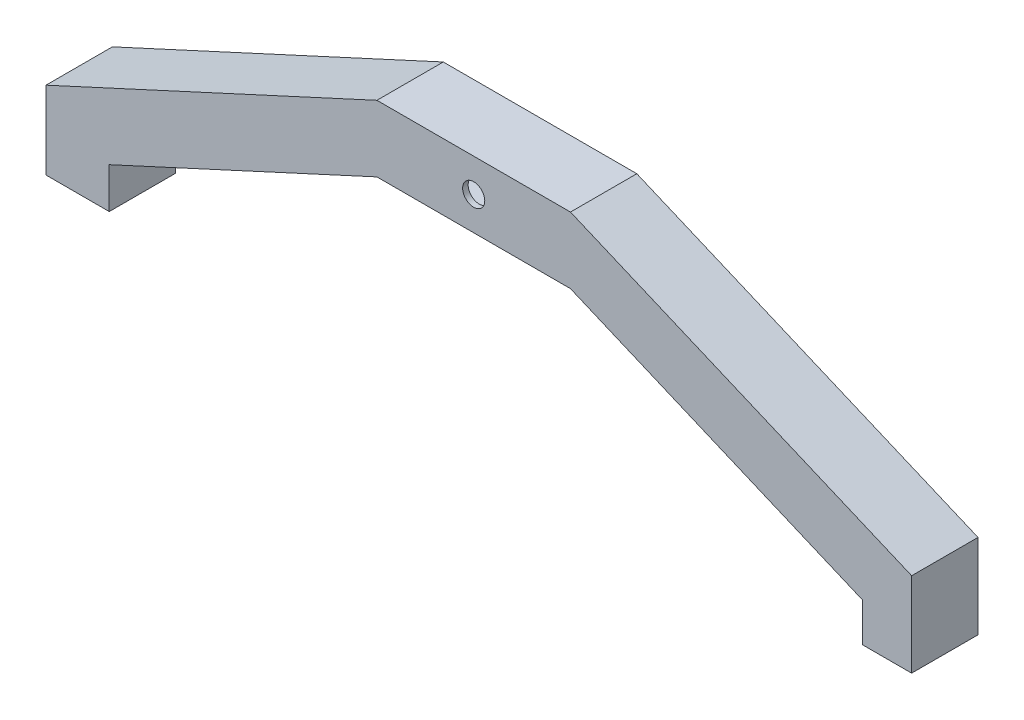
ISO-10303-21;
HEADER;
FILE_DESCRIPTION(('STEP AP214'),'2;1');
FILE_NAME('part.step','',(''),(''),'','','');
FILE_SCHEMA(('AUTOMOTIVE_DESIGN { 1 0 10303 214 1 1 1 1 }'));
ENDSEC;
DATA;
#1=APPLICATION_CONTEXT('core data for automotive mechanical design processes');
#2=APPLICATION_PROTOCOL_DEFINITION('international standard','automotive_design',2000,#1);
#3=PRODUCT_CONTEXT('',#1,'mechanical');
#4=PRODUCT('Part','Part','',(#3));
#5=PRODUCT_RELATED_PRODUCT_CATEGORY('part','',(#4));
#6=PRODUCT_DEFINITION_FORMATION('','',#4);
#7=PRODUCT_DEFINITION_CONTEXT('part definition',#1,'design');
#8=PRODUCT_DEFINITION('design','',#6,#7);
#9=PRODUCT_DEFINITION_SHAPE('','',#8);
#10=(LENGTH_UNIT() NAMED_UNIT(*) SI_UNIT(.MILLI.,.METRE.));
#11=(NAMED_UNIT(*) PLANE_ANGLE_UNIT() SI_UNIT($,.RADIAN.));
#12=(NAMED_UNIT(*) SI_UNIT($,.STERADIAN.) SOLID_ANGLE_UNIT());
#13=UNCERTAINTY_MEASURE_WITH_UNIT(LENGTH_MEASURE(1.E-05),#10,'distance_accuracy_value','');
#14=(GEOMETRIC_REPRESENTATION_CONTEXT(3) GLOBAL_UNCERTAINTY_ASSIGNED_CONTEXT((#13)) GLOBAL_UNIT_ASSIGNED_CONTEXT((#10,
#11,#12)) REPRESENTATION_CONTEXT('',''));
#15=CARTESIAN_POINT('',(0.,0.,0.));
#16=DIRECTION('',(0.,0.,1.));
#17=DIRECTION('',(1.,0.,0.));
#18=AXIS2_PLACEMENT_3D('',#15,#16,#17);
#19=CARTESIAN_POINT('',(0.,-35.6300000000504,12.));
#20=DIRECTION('',(0.,1.,0.));
#21=DIRECTION('',(0.,0.,1.));
#22=AXIS2_PLACEMENT_3D('',#19,#20,#21);
#23=PLANE('',#22);
#24=DIRECTION('',(1.,0.,0.));
#25=VECTOR('',#24,1.);
#26=CARTESIAN_POINT('',(0.,-35.6300000000504,0.));
#27=LINE('',#26,#25);
#28=CARTESIAN_POINT('',(-77.342905626536,-35.6300000000504,0.));
#29=VERTEX_POINT('',#28);
#30=CARTESIAN_POINT('',(-65.9062886066089,-35.6300000000504,0.));
#31=VERTEX_POINT('',#30);
#32=EDGE_CURVE('E191',#29,#31,#27,.T.);
#33=ORIENTED_EDGE('',*,*,#32,.T.);
#34=DIRECTION('',(0.,0.,-1.));
#35=VECTOR('',#34,1.);
#36=CARTESIAN_POINT('',(-65.9062886066089,-35.6300000000504,12.));
#37=LINE('',#36,#35);
#38=CARTESIAN_POINT('',(-65.9062886066089,-35.6300000000504,12.));
#39=VERTEX_POINT('',#38);
#40=EDGE_CURVE('E209',#39,#31,#37,.T.);
#41=ORIENTED_EDGE('',*,*,#40,.F.);
#42=DIRECTION('',(1.,0.,0.));
#43=VECTOR('',#42,1.);
#44=CARTESIAN_POINT('',(0.,-35.6300000000504,12.));
#45=LINE('',#44,#43);
#46=CARTESIAN_POINT('',(-77.342905626536,-35.6300000000504,12.));
#47=VERTEX_POINT('',#46);
#48=EDGE_CURVE('E250',#47,#39,#45,.T.);
#49=ORIENTED_EDGE('',*,*,#48,.F.);
#50=DIRECTION('',(0.,0.,-1.));
#51=VECTOR('',#50,1.);
#52=CARTESIAN_POINT('',(-77.342905626536,-35.6300000000504,12.));
#53=LINE('',#52,#51);
#54=EDGE_CURVE('E211',#47,#29,#53,.T.);
#55=ORIENTED_EDGE('',*,*,#54,.T.);
#56=EDGE_LOOP('',(#33,#41,#49,#55));
#57=FACE_BOUND('',#56,.T.);
#58=DIRECTION('',(1.,0.,0.));
#59=VECTOR('',#58,1.);
#60=CARTESIAN_POINT('',(0.,-35.6300000000504,1.));
#61=LINE('',#60,#59);
#62=CARTESIAN_POINT('',(-76.342905626536,-35.6300000000504,1.));
#63=VERTEX_POINT('',#62);
#64=CARTESIAN_POINT('',(-66.9062886066089,-35.6300000000504,1.));
#65=VERTEX_POINT('',#64);
#66=EDGE_CURVE('E626',#63,#65,#61,.T.);
#67=ORIENTED_EDGE('',*,*,#66,.F.);
#68=DIRECTION('',(0.,0.,-1.));
#69=VECTOR('',#68,1.);
#70=CARTESIAN_POINT('',(-76.342905626536,-35.6300000000504,12.));
#71=LINE('',#70,#69);
#72=CARTESIAN_POINT('',(-76.342905626536,-35.6300000000504,11.));
#73=VERTEX_POINT('',#72);
#74=EDGE_CURVE('E620',#73,#63,#71,.T.);
#75=ORIENTED_EDGE('',*,*,#74,.F.);
#76=DIRECTION('',(1.,0.,0.));
#77=VECTOR('',#76,1.);
#78=CARTESIAN_POINT('',(0.,-35.6300000000504,11.));
#79=LINE('',#78,#77);
#80=CARTESIAN_POINT('',(-66.9062886066089,-35.6300000000504,11.));
#81=VERTEX_POINT('',#80);
#82=EDGE_CURVE('E55',#73,#81,#79,.T.);
#83=ORIENTED_EDGE('',*,*,#82,.T.);
#84=DIRECTION('',(0.,0.,-1.));
#85=VECTOR('',#84,1.);
#86=CARTESIAN_POINT('',(-66.9062886066089,-35.6300000000504,12.));
#87=LINE('',#86,#85);
#88=EDGE_CURVE('E648',#81,#65,#87,.T.);
#89=ORIENTED_EDGE('',*,*,#88,.T.);
#90=EDGE_LOOP('',(#67,#75,#83,#89));
#91=FACE_BOUND('',#90,.T.);
#92=ADVANCED_FACE('F39',(#57,#91),#23,.F.);
#93=CARTESIAN_POINT('',(0.,-35.3685376037723,12.));
#94=DIRECTION('',(0.,1.,0.));
#95=DIRECTION('',(0.,0.,1.));
#96=AXIS2_PLACEMENT_3D('',#93,#94,#95);
#97=PLANE('',#96);
#98=DIRECTION('',(1.,0.,0.));
#99=VECTOR('',#98,1.);
#100=CARTESIAN_POINT('',(0.,-35.3685376037723,0.));
#101=LINE('',#100,#99);
#102=CARTESIAN_POINT('',(70.2639033973968,-35.3685376037723,0.));
#103=VERTEX_POINT('',#102);
#104=CARTESIAN_POINT('',(79.1949734298234,-35.3685376037723,0.));
#105=VERTEX_POINT('',#104);
#106=EDGE_CURVE('E174',#103,#105,#101,.T.);
#107=ORIENTED_EDGE('',*,*,#106,.T.);
#108=DIRECTION('',(0.,0.,-1.));
#109=VECTOR('',#108,1.);
#110=CARTESIAN_POINT('',(79.1949734298234,-35.3685376037723,12.));
#111=LINE('',#110,#109);
#112=CARTESIAN_POINT('',(79.1949734298234,-35.3685376037723,12.));
#113=VERTEX_POINT('',#112);
#114=EDGE_CURVE('E11',#113,#105,#111,.T.);
#115=ORIENTED_EDGE('',*,*,#114,.F.);
#116=DIRECTION('',(1.,0.,0.));
#117=VECTOR('',#116,1.);
#118=CARTESIAN_POINT('',(0.,-35.3685376037723,12.));
#119=LINE('',#118,#117);
#120=CARTESIAN_POINT('',(70.2639033973968,-35.3685376037723,12.));
#121=VERTEX_POINT('',#120);
#122=EDGE_CURVE('E203',#121,#113,#119,.T.);
#123=ORIENTED_EDGE('',*,*,#122,.F.);
#124=DIRECTION('',(0.,0.,-1.));
#125=VECTOR('',#124,1.);
#126=CARTESIAN_POINT('',(70.2639033973968,-35.3685376037723,12.));
#127=LINE('',#126,#125);
#128=EDGE_CURVE('E170',#121,#103,#127,.T.);
#129=ORIENTED_EDGE('',*,*,#128,.T.);
#130=EDGE_LOOP('',(#107,#115,#123,#129));
#131=FACE_BOUND('',#130,.T.);
#132=ADVANCED_FACE('F41',(#131),#97,.F.);
#133=CARTESIAN_POINT('',(79.1949734298234,0.,12.));
#134=DIRECTION('',(-1.,0.,0.));
#135=DIRECTION('',(0.,0.,1.));
#136=AXIS2_PLACEMENT_3D('',#133,#134,#135);
#137=PLANE('',#136);
#138=DIRECTION('',(0.,1.,0.));
#139=VECTOR('',#138,1.);
#140=CARTESIAN_POINT('',(79.1949734298234,0.,0.));
#141=LINE('',#140,#139);
#142=CARTESIAN_POINT('',(79.1949734298234,-20.1080830229284,0.));
#143=VERTEX_POINT('',#142);
#144=EDGE_CURVE('E177',#105,#143,#141,.T.);
#145=ORIENTED_EDGE('',*,*,#144,.T.);
#146=DIRECTION('',(0.,0.,-1.));
#147=VECTOR('',#146,1.);
#148=CARTESIAN_POINT('',(79.1949734298234,-20.1080830229284,12.));
#149=LINE('',#148,#147);
#150=CARTESIAN_POINT('',(79.1949734298234,-20.1080830229284,12.));
#151=VERTEX_POINT('',#150);
#152=EDGE_CURVE('E48',#151,#143,#149,.T.);
#153=ORIENTED_EDGE('',*,*,#152,.F.);
#154=DIRECTION('',(0.,1.,0.));
#155=VECTOR('',#154,1.);
#156=CARTESIAN_POINT('',(79.1949734298234,0.,12.));
#157=LINE('',#156,#155);
#158=EDGE_CURVE('E117',#113,#151,#157,.T.);
#159=ORIENTED_EDGE('',*,*,#158,.F.);
#160=ORIENTED_EDGE('',*,*,#114,.T.);
#161=EDGE_LOOP('',(#145,#153,#159,#160));
#162=FACE_BOUND('',#161,.T.);
#163=ADVANCED_FACE('F227',(#162),#137,.F.);
#164=CARTESIAN_POINT('',(4.81137648257786,11.3695725570298,12.));
#165=DIRECTION('',(0.389720557312309,0.920933161097038,0.));
#166=DIRECTION('',(-0.920933161097038,0.389720557312309,0.));
#167=AXIS2_PLACEMENT_3D('',#164,#165,#166);
#168=PLANE('',#167);
#169=DIRECTION('',(0.920933161097038,-0.389720557312309,0.));
#170=VECTOR('',#169,1.);
#171=CARTESIAN_POINT('',(4.81137648257786,11.3695725570298,0.));
#172=LINE('',#171,#170);
#173=CARTESIAN_POINT('',(17.4999999999895,5.99999999994959,0.));
#174=VERTEX_POINT('',#173);
#175=EDGE_CURVE('E181',#174,#143,#172,.T.);
#176=ORIENTED_EDGE('',*,*,#175,.F.);
#177=DIRECTION('',(0.,0.,-1.));
#178=VECTOR('',#177,1.);
#179=CARTESIAN_POINT('',(17.4999999999895,5.99999999994959,12.));
#180=LINE('',#179,#178);
#181=CARTESIAN_POINT('',(17.4999999999895,5.99999999994959,12.));
#182=VERTEX_POINT('',#181);
#183=EDGE_CURVE('E219',#182,#174,#180,.T.);
#184=ORIENTED_EDGE('',*,*,#183,.F.);
#185=DIRECTION('',(0.920933161097038,-0.389720557312309,0.));
#186=VECTOR('',#185,1.);
#187=CARTESIAN_POINT('',(4.81137648257786,11.3695725570298,12.));
#188=LINE('',#187,#186);
#189=EDGE_CURVE('E226',#182,#151,#188,.T.);
#190=ORIENTED_EDGE('',*,*,#189,.T.);
#191=ORIENTED_EDGE('',*,*,#152,.T.);
#192=EDGE_LOOP('',(#176,#184,#190,#191));
#193=FACE_BOUND('',#192,.T.);
#194=ADVANCED_FACE('F224',(#193),#168,.T.);
#195=CARTESIAN_POINT('',(0.,5.99999999994959,12.));
#196=DIRECTION('',(0.,1.,0.));
#197=DIRECTION('',(0.,0.,1.));
#198=AXIS2_PLACEMENT_3D('',#195,#196,#197);
#199=PLANE('',#198);
#200=DIRECTION('',(1.,0.,0.));
#201=VECTOR('',#200,1.);
#202=CARTESIAN_POINT('',(0.,5.99999999994959,0.));
#203=LINE('',#202,#201);
#204=CARTESIAN_POINT('',(-17.5000000000105,5.9999999999496,0.));
#205=VERTEX_POINT('',#204);
#206=EDGE_CURVE('E184',#205,#174,#203,.T.);
#207=ORIENTED_EDGE('',*,*,#206,.F.);
#208=DIRECTION('',(0.,0.,-1.));
#209=VECTOR('',#208,1.);
#210=CARTESIAN_POINT('',(-17.5000000000105,5.9999999999496,12.));
#211=LINE('',#210,#209);
#212=CARTESIAN_POINT('',(-17.5000000000105,5.9999999999496,12.));
#213=VERTEX_POINT('',#212);
#214=EDGE_CURVE('E217',#213,#205,#211,.T.);
#215=ORIENTED_EDGE('',*,*,#214,.F.);
#216=DIRECTION('',(1.,0.,0.));
#217=VECTOR('',#216,1.);
#218=CARTESIAN_POINT('',(0.,5.99999999994959,12.));
#219=LINE('',#218,#217);
#220=EDGE_CURVE('E240',#213,#182,#219,.T.);
#221=ORIENTED_EDGE('',*,*,#220,.T.);
#222=ORIENTED_EDGE('',*,*,#183,.T.);
#223=EDGE_LOOP('',(#207,#215,#221,#222));
#224=FACE_BOUND('',#223,.T.);
#225=ADVANCED_FACE('F236',(#224),#199,.T.);
#226=CARTESIAN_POINT('',(-5.33954145580796,11.5983296353314,12.));
#227=DIRECTION('',(0.418184177516307,-0.908362259054728,0.));
#228=DIRECTION('',(0.908362259054729,0.418184177516307,0.));
#229=AXIS2_PLACEMENT_3D('',#226,#227,#228);
#230=PLANE('',#229);
#231=DIRECTION('',(-0.908362259054729,-0.418184177516307,0.));
#232=VECTOR('',#231,1.);
#233=CARTESIAN_POINT('',(-5.33954145580796,11.5983296353314,0.));
#234=LINE('',#233,#232);
#235=CARTESIAN_POINT('',(-77.342905626536,-21.5499736148247,0.));
#236=VERTEX_POINT('',#235);
#237=EDGE_CURVE('E187',#205,#236,#234,.T.);
#238=ORIENTED_EDGE('',*,*,#237,.T.);
#239=DIRECTION('',(0.,0.,-1.));
#240=VECTOR('',#239,1.);
#241=CARTESIAN_POINT('',(-77.342905626536,-21.5499736148247,12.));
#242=LINE('',#241,#240);
#243=CARTESIAN_POINT('',(-77.342905626536,-21.5499736148247,12.));
#244=VERTEX_POINT('',#243);
#245=EDGE_CURVE('E214',#244,#236,#242,.T.);
#246=ORIENTED_EDGE('',*,*,#245,.F.);
#247=DIRECTION('',(-0.908362259054729,-0.418184177516307,0.));
#248=VECTOR('',#247,1.);
#249=CARTESIAN_POINT('',(-5.33954145580796,11.5983296353314,12.));
#250=LINE('',#249,#248);
#251=EDGE_CURVE('E242',#213,#244,#250,.T.);
#252=ORIENTED_EDGE('',*,*,#251,.F.);
#253=ORIENTED_EDGE('',*,*,#214,.T.);
#254=EDGE_LOOP('',(#238,#246,#252,#253));
#255=FACE_BOUND('',#254,.T.);
#256=ADVANCED_FACE('F285',(#255),#230,.F.);
#257=CARTESIAN_POINT('',(-77.342905626536,0.,12.));
#258=DIRECTION('',(1.,0.,0.));
#259=DIRECTION('',(0.,0.,-1.));
#260=AXIS2_PLACEMENT_3D('',#257,#258,#259);
#261=PLANE('',#260);
#262=DIRECTION('',(0.,-1.,0.));
#263=VECTOR('',#262,1.);
#264=CARTESIAN_POINT('',(-77.342905626536,0.,0.));
#265=LINE('',#264,#263);
#266=EDGE_CURVE('E189',#236,#29,#265,.T.);
#267=ORIENTED_EDGE('',*,*,#266,.T.);
#268=ORIENTED_EDGE('',*,*,#54,.F.);
#269=DIRECTION('',(0.,-1.,0.));
#270=VECTOR('',#269,1.);
#271=CARTESIAN_POINT('',(-77.342905626536,0.,12.));
#272=LINE('',#271,#270);
#273=EDGE_CURVE('E248',#244,#47,#272,.T.);
#274=ORIENTED_EDGE('',*,*,#273,.F.);
#275=ORIENTED_EDGE('',*,*,#245,.T.);
#276=EDGE_LOOP('',(#267,#268,#274,#275));
#277=FACE_BOUND('',#276,.T.);
#278=ADVANCED_FACE('F274',(#277),#261,.F.);
#279=CARTESIAN_POINT('',(-65.9062886066089,0.,12.));
#280=DIRECTION('',(1.,0.,0.));
#281=DIRECTION('',(0.,0.,-1.));
#282=AXIS2_PLACEMENT_3D('',#279,#280,#281);
#283=PLANE('',#282);
#284=DIRECTION('',(0.,-1.,0.));
#285=VECTOR('',#284,1.);
#286=CARTESIAN_POINT('',(-65.9062886066089,0.,0.));
#287=LINE('',#286,#285);
#288=CARTESIAN_POINT('',(-65.9062886066089,-28.284880052897,0.));
#289=VERTEX_POINT('',#288);
#290=EDGE_CURVE('E194',#289,#31,#287,.T.);
#291=ORIENTED_EDGE('',*,*,#290,.F.);
#292=DIRECTION('',(0.,0.,-1.));
#293=VECTOR('',#292,1.);
#294=CARTESIAN_POINT('',(-65.9062886066089,-28.284880052897,12.));
#295=LINE('',#294,#293);
#296=CARTESIAN_POINT('',(-65.9062886066089,-28.284880052897,12.));
#297=VERTEX_POINT('',#296);
#298=EDGE_CURVE('E207',#297,#289,#295,.T.);
#299=ORIENTED_EDGE('',*,*,#298,.F.);
#300=DIRECTION('',(0.,-1.,0.));
#301=VECTOR('',#300,1.);
#302=CARTESIAN_POINT('',(-65.9062886066089,0.,12.));
#303=LINE('',#302,#301);
#304=EDGE_CURVE('E252',#297,#39,#303,.T.);
#305=ORIENTED_EDGE('',*,*,#304,.T.);
#306=ORIENTED_EDGE('',*,*,#40,.T.);
#307=EDGE_LOOP('',(#291,#299,#305,#306));
#308=FACE_BOUND('',#307,.T.);
#309=ADVANCED_FACE('F256',(#308),#283,.T.);
#310=CARTESIAN_POINT('',(-0.781188765532078,1.69686571123132,12.));
#311=DIRECTION('',(-0.418184177516307,0.908362259054728,0.));
#312=DIRECTION('',(-0.908362259054729,-0.418184177516307,0.));
#313=AXIS2_PLACEMENT_3D('',#310,#311,#312);
#314=PLANE('',#313);
#315=DIRECTION('',(0.908362259054729,0.418184177516307,0.));
#316=VECTOR('',#315,1.);
#317=CARTESIAN_POINT('',(-0.781188765532078,1.69686571123132,0.));
#318=LINE('',#317,#316);
#319=CARTESIAN_POINT('',(-17.5000000000105,-6.00000000005041,0.));
#320=VERTEX_POINT('',#319);
#321=EDGE_CURVE('E197',#289,#320,#318,.T.);
#322=ORIENTED_EDGE('',*,*,#321,.T.);
#323=DIRECTION('',(0.,0.,-1.));
#324=VECTOR('',#323,1.);
#325=CARTESIAN_POINT('',(-17.5000000000105,-6.00000000005041,12.));
#326=LINE('',#325,#324);
#327=CARTESIAN_POINT('',(-17.5000000000105,-6.00000000005041,12.));
#328=VERTEX_POINT('',#327);
#329=EDGE_CURVE('E165',#328,#320,#326,.T.);
#330=ORIENTED_EDGE('',*,*,#329,.F.);
#331=DIRECTION('',(0.908362259054729,0.418184177516307,0.));
#332=VECTOR('',#331,1.);
#333=CARTESIAN_POINT('',(-0.781188765532078,1.69686571123132,12.));
#334=LINE('',#333,#332);
#335=EDGE_CURVE('E153',#297,#328,#334,.T.);
#336=ORIENTED_EDGE('',*,*,#335,.F.);
#337=ORIENTED_EDGE('',*,*,#298,.T.);
#338=EDGE_LOOP('',(#322,#330,#336,#337));
#339=FACE_BOUND('',#338,.T.);
#340=ADVANCED_FACE('F266',(#339),#314,.F.);
#341=CARTESIAN_POINT('',(0.,-6.00000000005041,12.));
#342=DIRECTION('',(0.,1.,0.));
#343=DIRECTION('',(0.,0.,1.));
#344=AXIS2_PLACEMENT_3D('',#341,#342,#343);
#345=PLANE('',#344);
#346=DIRECTION('',(1.,0.,0.));
#347=VECTOR('',#346,1.);
#348=CARTESIAN_POINT('',(0.,-6.00000000005041,0.));
#349=LINE('',#348,#347);
#350=CARTESIAN_POINT('',(17.4999999999895,-6.00000000005041,0.));
#351=VERTEX_POINT('',#350);
#352=EDGE_CURVE('E162',#320,#351,#349,.T.);
#353=ORIENTED_EDGE('',*,*,#352,.T.);
#354=DIRECTION('',(0.,0.,-1.));
#355=VECTOR('',#354,1.);
#356=CARTESIAN_POINT('',(17.4999999999895,-6.00000000005041,12.));
#357=LINE('',#356,#355);
#358=CARTESIAN_POINT('',(17.4999999999895,-6.00000000005041,12.));
#359=VERTEX_POINT('',#358);
#360=EDGE_CURVE('E159',#359,#351,#357,.T.);
#361=ORIENTED_EDGE('',*,*,#360,.F.);
#362=DIRECTION('',(1.,0.,0.));
#363=VECTOR('',#362,1.);
#364=CARTESIAN_POINT('',(0.,-6.00000000005041,12.));
#365=LINE('',#364,#363);
#366=EDGE_CURVE('E145',#328,#359,#365,.T.);
#367=ORIENTED_EDGE('',*,*,#366,.F.);
#368=ORIENTED_EDGE('',*,*,#329,.T.);
#369=EDGE_LOOP('',(#353,#361,#367,#368));
#370=FACE_BOUND('',#369,.T.);
#371=ADVANCED_FACE('F160',(#370),#345,.F.);
#372=CARTESIAN_POINT('',(0.504497465096369,1.19215791053157,12.));
#373=DIRECTION('',(0.389720557312309,0.920933161097038,0.));
#374=DIRECTION('',(-0.920933161097038,0.38972055731231,0.));
#375=AXIS2_PLACEMENT_3D('',#372,#373,#374);
#376=PLANE('',#375);
#377=DIRECTION('',(0.920933161097038,-0.389720557312309,0.));
#378=VECTOR('',#377,1.);
#379=CARTESIAN_POINT('',(0.504497465096369,1.19215791053157,0.));
#380=LINE('',#379,#378);
#381=CARTESIAN_POINT('',(70.2639033973968,-28.3286322034071,0.));
#382=VERTEX_POINT('',#381);
#383=EDGE_CURVE('E200',#351,#382,#380,.T.);
#384=ORIENTED_EDGE('',*,*,#383,.T.);
#385=DIRECTION('',(0.,0.,-1.));
#386=VECTOR('',#385,1.);
#387=CARTESIAN_POINT('',(70.2639033973968,-28.3286322034071,12.));
#388=LINE('',#387,#386);
#389=CARTESIAN_POINT('',(70.2639033973968,-28.3286322034071,12.));
#390=VERTEX_POINT('',#389);
#391=EDGE_CURVE('E166',#390,#382,#388,.T.);
#392=ORIENTED_EDGE('',*,*,#391,.F.);
#393=DIRECTION('',(0.920933161097038,-0.389720557312309,0.));
#394=VECTOR('',#393,1.);
#395=CARTESIAN_POINT('',(0.504497465096369,1.19215791053157,12.));
#396=LINE('',#395,#394);
#397=EDGE_CURVE('E149',#359,#390,#396,.T.);
#398=ORIENTED_EDGE('',*,*,#397,.F.);
#399=ORIENTED_EDGE('',*,*,#360,.T.);
#400=EDGE_LOOP('',(#384,#392,#398,#399));
#401=FACE_BOUND('',#400,.T.);
#402=ADVANCED_FACE('F168',(#401),#376,.F.);
#403=CARTESIAN_POINT('',(70.2639033973968,0.,12.));
#404=DIRECTION('',(1.,0.,0.));
#405=DIRECTION('',(0.,0.,-1.));
#406=AXIS2_PLACEMENT_3D('',#403,#404,#405);
#407=PLANE('',#406);
#408=DIRECTION('',(0.,-1.,0.));
#409=VECTOR('',#408,1.);
#410=CARTESIAN_POINT('',(70.2639033973968,0.,0.));
#411=LINE('',#410,#409);
#412=EDGE_CURVE('E109',#382,#103,#411,.T.);
#413=ORIENTED_EDGE('',*,*,#412,.T.);
#414=ORIENTED_EDGE('',*,*,#128,.F.);
#415=DIRECTION('',(0.,-1.,0.));
#416=VECTOR('',#415,1.);
#417=CARTESIAN_POINT('',(70.2639033973968,0.,12.));
#418=LINE('',#417,#416);
#419=EDGE_CURVE('E64',#390,#121,#418,.T.);
#420=ORIENTED_EDGE('',*,*,#419,.F.);
#421=ORIENTED_EDGE('',*,*,#391,.T.);
#422=EDGE_LOOP('',(#413,#414,#420,#421));
#423=FACE_BOUND('',#422,.T.);
#424=ADVANCED_FACE('F340',(#423),#407,.F.);
#425=CARTESIAN_POINT('',(0.,0.,12.));
#426=DIRECTION('',(0.,0.,1.));
#427=DIRECTION('',(1.,0.,0.));
#428=AXIS2_PLACEMENT_3D('',#425,#426,#427);
#429=PLANE('',#428);
#430=CARTESIAN_POINT('',(0.,-5.04032579562441E-11,12.));
#431=DIRECTION('',(0.,0.,1.));
#432=DIRECTION('',(1.,0.,0.));
#433=AXIS2_PLACEMENT_3D('',#430,#431,#432);
#434=CIRCLE('',#433,2.00000000001474);
#435=CARTESIAN_POINT('',(2.00000000001474,-5.04032579562441E-11,12.));
#436=VERTEX_POINT('',#435);
#437=EDGE_CURVE('E561',#436,#436,#434,.T.);
#438=ORIENTED_EDGE('',*,*,#437,.F.);
#439=EDGE_LOOP('',(#438));
#440=FACE_BOUND('',#439,.T.);
#441=ORIENTED_EDGE('',*,*,#122,.T.);
#442=ORIENTED_EDGE('',*,*,#158,.T.);
#443=ORIENTED_EDGE('',*,*,#189,.F.);
#444=ORIENTED_EDGE('',*,*,#220,.F.);
#445=ORIENTED_EDGE('',*,*,#251,.T.);
#446=ORIENTED_EDGE('',*,*,#273,.T.);
#447=ORIENTED_EDGE('',*,*,#48,.T.);
#448=ORIENTED_EDGE('',*,*,#304,.F.);
#449=ORIENTED_EDGE('',*,*,#335,.T.);
#450=ORIENTED_EDGE('',*,*,#366,.T.);
#451=ORIENTED_EDGE('',*,*,#397,.T.);
#452=ORIENTED_EDGE('',*,*,#419,.T.);
#453=EDGE_LOOP('',(#441,#442,#443,#444,#445,#446,#447,#448,#449,#450,#451,#452));
#454=FACE_BOUND('',#453,.T.);
#455=ADVANCED_FACE('F147',(#440,#454),#429,.T.);
#456=CARTESIAN_POINT('',(0.,0.,0.));
#457=DIRECTION('',(0.,0.,1.));
#458=DIRECTION('',(1.,0.,0.));
#459=AXIS2_PLACEMENT_3D('',#456,#457,#458);
#460=PLANE('',#459);
#461=CARTESIAN_POINT('',(0.,-5.04032579562441E-11,0.));
#462=DIRECTION('',(0.,0.,1.));
#463=DIRECTION('',(1.,0.,0.));
#464=AXIS2_PLACEMENT_3D('',#461,#462,#463);
#465=CIRCLE('',#464,2.00000000001474);
#466=CARTESIAN_POINT('',(2.00000000001474,-5.04032579562441E-11,0.));
#467=VERTEX_POINT('',#466);
#468=EDGE_CURVE('E571',#467,#467,#465,.T.);
#469=ORIENTED_EDGE('',*,*,#468,.T.);
#470=EDGE_LOOP('',(#469));
#471=FACE_BOUND('',#470,.T.);
#472=ORIENTED_EDGE('',*,*,#106,.F.);
#473=ORIENTED_EDGE('',*,*,#412,.F.);
#474=ORIENTED_EDGE('',*,*,#383,.F.);
#475=ORIENTED_EDGE('',*,*,#352,.F.);
#476=ORIENTED_EDGE('',*,*,#321,.F.);
#477=ORIENTED_EDGE('',*,*,#290,.T.);
#478=ORIENTED_EDGE('',*,*,#32,.F.);
#479=ORIENTED_EDGE('',*,*,#266,.F.);
#480=ORIENTED_EDGE('',*,*,#237,.F.);
#481=ORIENTED_EDGE('',*,*,#206,.T.);
#482=ORIENTED_EDGE('',*,*,#175,.T.);
#483=ORIENTED_EDGE('',*,*,#144,.F.);
#484=EDGE_LOOP('',(#472,#473,#474,#475,#476,#477,#478,#479,#480,#481,#482,#483));
#485=FACE_BOUND('',#484,.T.);
#486=ADVANCED_FACE('F231',(#471,#485),#460,.F.);
#487=CARTESIAN_POINT('',(0.,-34.3685376037723,12.));
#488=DIRECTION('',(0.,1.,0.));
#489=DIRECTION('',(0.,0.,1.));
#490=AXIS2_PLACEMENT_3D('',#487,#488,#489);
#491=PLANE('',#490);
#492=DIRECTION('',(1.,0.,0.));
#493=VECTOR('',#492,1.);
#494=CARTESIAN_POINT('',(0.,-34.3685376037723,1.));
#495=LINE('',#494,#493);
#496=CARTESIAN_POINT('',(71.2639033973968,-34.3685376037723,1.));
#497=VERTEX_POINT('',#496);
#498=CARTESIAN_POINT('',(78.1949734298234,-34.3685376037723,1.));
#499=VERTEX_POINT('',#498);
#500=EDGE_CURVE('E565',#497,#499,#495,.T.);
#501=ORIENTED_EDGE('',*,*,#500,.F.);
#502=DIRECTION('',(0.,0.,-1.));
#503=VECTOR('',#502,1.);
#504=CARTESIAN_POINT('',(71.2639033973968,-34.3685376037723,12.));
#505=LINE('',#504,#503);
#506=CARTESIAN_POINT('',(71.2639033973968,-34.3685376037723,11.));
#507=VERTEX_POINT('',#506);
#508=EDGE_CURVE('E583',#507,#497,#505,.T.);
#509=ORIENTED_EDGE('',*,*,#508,.F.);
#510=DIRECTION('',(1.,0.,0.));
#511=VECTOR('',#510,1.);
#512=CARTESIAN_POINT('',(0.,-34.3685376037723,11.));
#513=LINE('',#512,#511);
#514=CARTESIAN_POINT('',(78.1949734298234,-34.3685376037723,11.));
#515=VERTEX_POINT('',#514);
#516=EDGE_CURVE('E578',#507,#515,#513,.T.);
#517=ORIENTED_EDGE('',*,*,#516,.T.);
#518=DIRECTION('',(0.,0.,-1.));
#519=VECTOR('',#518,1.);
#520=CARTESIAN_POINT('',(78.1949734298234,-34.3685376037723,12.));
#521=LINE('',#520,#519);
#522=EDGE_CURVE('E178',#515,#499,#521,.T.);
#523=ORIENTED_EDGE('',*,*,#522,.T.);
#524=EDGE_LOOP('',(#501,#509,#517,#523));
#525=FACE_BOUND('',#524,.T.);
#526=ADVANCED_FACE('F363',(#525),#491,.T.);
#527=CARTESIAN_POINT('',(78.1949734298234,0.,12.));
#528=DIRECTION('',(-1.,0.,0.));
#529=DIRECTION('',(0.,0.,1.));
#530=AXIS2_PLACEMENT_3D('',#527,#528,#529);
#531=PLANE('',#530);
#532=DIRECTION('',(0.,1.,0.));
#533=VECTOR('',#532,1.);
#534=CARTESIAN_POINT('',(78.1949734298234,0.,1.));
#535=LINE('',#534,#533);
#536=CARTESIAN_POINT('',(78.1949734298234,-20.770758088251,1.));
#537=VERTEX_POINT('',#536);
#538=EDGE_CURVE('E568',#499,#537,#535,.T.);
#539=ORIENTED_EDGE('',*,*,#538,.F.);
#540=ORIENTED_EDGE('',*,*,#522,.F.);
#541=DIRECTION('',(0.,1.,0.));
#542=VECTOR('',#541,1.);
#543=CARTESIAN_POINT('',(78.1949734298234,0.,11.));
#544=LINE('',#543,#542);
#545=CARTESIAN_POINT('',(78.1949734298234,-20.770758088251,11.));
#546=VERTEX_POINT('',#545);
#547=EDGE_CURVE('E581',#515,#546,#544,.T.);
#548=ORIENTED_EDGE('',*,*,#547,.T.);
#549=DIRECTION('',(0.,0.,-1.));
#550=VECTOR('',#549,1.);
#551=CARTESIAN_POINT('',(78.1949734298234,-20.770758088251,12.));
#552=LINE('',#551,#550);
#553=EDGE_CURVE('E577',#546,#537,#552,.T.);
#554=ORIENTED_EDGE('',*,*,#553,.T.);
#555=EDGE_LOOP('',(#539,#540,#548,#554));
#556=FACE_BOUND('',#555,.T.);
#557=ADVANCED_FACE('F368',(#556),#531,.T.);
#558=CARTESIAN_POINT('',(4.42165592526555,10.4486393959327,12.));
#559=DIRECTION('',(0.389720557312309,0.920933161097038,0.));
#560=DIRECTION('',(-0.920933161097038,0.389720557312309,0.));
#561=AXIS2_PLACEMENT_3D('',#558,#559,#560);
#562=PLANE('',#561);
#563=DIRECTION('',(0.920933161097038,-0.389720557312309,0.));
#564=VECTOR('',#563,1.);
#565=CARTESIAN_POINT('',(4.42165592526555,10.4486393959327,1.));
#566=LINE('',#565,#564);
#567=CARTESIAN_POINT('',(17.2971191474929,4.99999999994959,1.));
#568=VERTEX_POINT('',#567);
#569=EDGE_CURVE('E590',#568,#537,#566,.T.);
#570=ORIENTED_EDGE('',*,*,#569,.T.);
#571=ORIENTED_EDGE('',*,*,#553,.F.);
#572=DIRECTION('',(0.920933161097038,-0.389720557312309,0.));
#573=VECTOR('',#572,1.);
#574=CARTESIAN_POINT('',(4.42165592526555,10.4486393959327,11.));
#575=LINE('',#574,#573);
#576=CARTESIAN_POINT('',(17.2971191474929,4.99999999994959,11.));
#577=VERTEX_POINT('',#576);
#578=EDGE_CURVE('E596',#577,#546,#575,.T.);
#579=ORIENTED_EDGE('',*,*,#578,.F.);
#580=DIRECTION('',(0.,0.,-1.));
#581=VECTOR('',#580,1.);
#582=CARTESIAN_POINT('',(17.2971191474929,4.99999999994959,12.));
#583=LINE('',#582,#581);
#584=EDGE_CURVE('E593',#577,#568,#583,.T.);
#585=ORIENTED_EDGE('',*,*,#584,.T.);
#586=EDGE_LOOP('',(#570,#571,#579,#585));
#587=FACE_BOUND('',#586,.T.);
#588=ADVANCED_FACE('F379',(#587),#562,.F.);
#589=CARTESIAN_POINT('',(0.,4.99999999994959,12.));
#590=DIRECTION('',(0.,1.,0.));
#591=DIRECTION('',(0.,0.,1.));
#592=AXIS2_PLACEMENT_3D('',#589,#590,#591);
#593=PLANE('',#592);
#594=DIRECTION('',(1.,0.,0.));
#595=VECTOR('',#594,1.);
#596=CARTESIAN_POINT('',(0.,4.99999999994959,1.));
#597=LINE('',#596,#595);
#598=CARTESIAN_POINT('',(-17.2808675079838,4.99999999994959,1.));
#599=VERTEX_POINT('',#598);
#600=EDGE_CURVE('E599',#599,#568,#597,.T.);
#601=ORIENTED_EDGE('',*,*,#600,.T.);
#602=ORIENTED_EDGE('',*,*,#584,.F.);
#603=DIRECTION('',(1.,0.,0.));
#604=VECTOR('',#603,1.);
#605=CARTESIAN_POINT('',(0.,4.99999999994959,11.));
#606=LINE('',#605,#604);
#607=CARTESIAN_POINT('',(-17.2808675079838,4.99999999994959,11.));
#608=VERTEX_POINT('',#607);
#609=EDGE_CURVE('E605',#608,#577,#606,.T.);
#610=ORIENTED_EDGE('',*,*,#609,.F.);
#611=DIRECTION('',(0.,0.,-1.));
#612=VECTOR('',#611,1.);
#613=CARTESIAN_POINT('',(-17.2808675079838,4.99999999994959,12.));
#614=LINE('',#613,#612);
#615=EDGE_CURVE('E602',#608,#599,#614,.T.);
#616=ORIENTED_EDGE('',*,*,#615,.T.);
#617=EDGE_LOOP('',(#601,#602,#610,#616));
#618=FACE_BOUND('',#617,.T.);
#619=ADVANCED_FACE('F390',(#618),#593,.F.);
#620=CARTESIAN_POINT('',(-4.92135727829165,10.6899673762767,12.));
#621=DIRECTION('',(0.418184177516307,-0.908362259054728,0.));
#622=DIRECTION('',(0.908362259054729,0.418184177516307,0.));
#623=AXIS2_PLACEMENT_3D('',#620,#621,#622);
#624=PLANE('',#623);
#625=DIRECTION('',(-0.908362259054729,-0.418184177516307,0.));
#626=VECTOR('',#625,1.);
#627=CARTESIAN_POINT('',(-4.92135727829165,10.6899673762767,1.));
#628=LINE('',#627,#626);
#629=CARTESIAN_POINT('',(-76.342905626536,-22.1904843985831,1.));
#630=VERTEX_POINT('',#629);
#631=EDGE_CURVE('E608',#599,#630,#628,.T.);
#632=ORIENTED_EDGE('',*,*,#631,.F.);
#633=ORIENTED_EDGE('',*,*,#615,.F.);
#634=DIRECTION('',(-0.908362259054729,-0.418184177516307,0.));
#635=VECTOR('',#634,1.);
#636=CARTESIAN_POINT('',(-4.92135727829165,10.6899673762767,11.));
#637=LINE('',#636,#635);
#638=CARTESIAN_POINT('',(-76.342905626536,-22.1904843985831,11.));
#639=VERTEX_POINT('',#638);
#640=EDGE_CURVE('E614',#608,#639,#637,.T.);
#641=ORIENTED_EDGE('',*,*,#640,.T.);
#642=DIRECTION('',(0.,0.,-1.));
#643=VECTOR('',#642,1.);
#644=CARTESIAN_POINT('',(-76.342905626536,-22.1904843985831,12.));
#645=LINE('',#644,#643);
#646=EDGE_CURVE('E611',#639,#630,#645,.T.);
#647=ORIENTED_EDGE('',*,*,#646,.T.);
#648=EDGE_LOOP('',(#632,#633,#641,#647));
#649=FACE_BOUND('',#648,.T.);
#650=ADVANCED_FACE('F401',(#649),#624,.T.);
#651=CARTESIAN_POINT('',(-76.342905626536,0.,12.));
#652=DIRECTION('',(1.,0.,0.));
#653=DIRECTION('',(0.,0.,-1.));
#654=AXIS2_PLACEMENT_3D('',#651,#652,#653);
#655=PLANE('',#654);
#656=DIRECTION('',(0.,-1.,0.));
#657=VECTOR('',#656,1.);
#658=CARTESIAN_POINT('',(-76.342905626536,0.,1.));
#659=LINE('',#658,#657);
#660=EDGE_CURVE('E617',#630,#63,#659,.T.);
#661=ORIENTED_EDGE('',*,*,#660,.F.);
#662=ORIENTED_EDGE('',*,*,#646,.F.);
#663=DIRECTION('',(0.,-1.,0.));
#664=VECTOR('',#663,1.);
#665=CARTESIAN_POINT('',(-76.342905626536,0.,11.));
#666=LINE('',#665,#664);
#667=EDGE_CURVE('E623',#639,#73,#666,.T.);
#668=ORIENTED_EDGE('',*,*,#667,.T.);
#669=ORIENTED_EDGE('',*,*,#74,.T.);
#670=EDGE_LOOP('',(#661,#662,#668,#669));
#671=FACE_BOUND('',#670,.T.);
#672=ADVANCED_FACE('F412',(#671),#655,.T.);
#673=CARTESIAN_POINT('',(-66.9062886066089,0.,12.));
#674=DIRECTION('',(1.,0.,0.));
#675=DIRECTION('',(0.,0.,-1.));
#676=AXIS2_PLACEMENT_3D('',#673,#674,#675);
#677=PLANE('',#676);
#678=DIRECTION('',(0.,-1.,0.));
#679=VECTOR('',#678,1.);
#680=CARTESIAN_POINT('',(-66.9062886066089,0.,1.));
#681=LINE('',#680,#679);
#682=CARTESIAN_POINT('',(-66.9062886066089,-27.6443692691386,1.));
#683=VERTEX_POINT('',#682);
#684=EDGE_CURVE('E641',#683,#65,#681,.T.);
#685=ORIENTED_EDGE('',*,*,#684,.T.);
#686=ORIENTED_EDGE('',*,*,#88,.F.);
#687=DIRECTION('',(0.,-1.,0.));
#688=VECTOR('',#687,1.);
#689=CARTESIAN_POINT('',(-66.9062886066089,0.,11.));
#690=LINE('',#689,#688);
#691=CARTESIAN_POINT('',(-66.9062886066089,-27.6443692691386,11.));
#692=VERTEX_POINT('',#691);
#693=EDGE_CURVE('E628',#692,#81,#690,.T.);
#694=ORIENTED_EDGE('',*,*,#693,.F.);
#695=DIRECTION('',(0.,0.,-1.));
#696=VECTOR('',#695,1.);
#697=CARTESIAN_POINT('',(-66.9062886066089,-27.6443692691386,12.));
#698=LINE('',#697,#696);
#699=EDGE_CURVE('E645',#692,#683,#698,.T.);
#700=ORIENTED_EDGE('',*,*,#699,.T.);
#701=EDGE_LOOP('',(#685,#686,#694,#700));
#702=FACE_BOUND('',#701,.T.);
#703=ADVANCED_FACE('F423',(#702),#677,.F.);
#704=CARTESIAN_POINT('',(-1.19937294304839,2.60522797028605,12.));
#705=DIRECTION('',(-0.418184177516307,0.908362259054728,0.));
#706=DIRECTION('',(-0.908362259054729,-0.418184177516307,0.));
#707=AXIS2_PLACEMENT_3D('',#704,#705,#706);
#708=PLANE('',#707);
#709=DIRECTION('',(0.908362259054729,0.418184177516307,0.));
#710=VECTOR('',#709,1.);
#711=CARTESIAN_POINT('',(-1.19937294304839,2.60522797028605,1.));
#712=LINE('',#711,#710);
#713=CARTESIAN_POINT('',(-17.7191324920372,-5.00000000005041,1.));
#714=VERTEX_POINT('',#713);
#715=EDGE_CURVE('E644',#683,#714,#712,.T.);
#716=ORIENTED_EDGE('',*,*,#715,.F.);
#717=ORIENTED_EDGE('',*,*,#699,.F.);
#718=DIRECTION('',(0.908362259054729,0.418184177516307,0.));
#719=VECTOR('',#718,1.);
#720=CARTESIAN_POINT('',(-1.19937294304839,2.60522797028605,11.));
#721=LINE('',#720,#719);
#722=CARTESIAN_POINT('',(-17.7191324920372,-5.00000000005041,11.));
#723=VERTEX_POINT('',#722);
#724=EDGE_CURVE('E630',#692,#723,#721,.T.);
#725=ORIENTED_EDGE('',*,*,#724,.T.);
#726=DIRECTION('',(0.,0.,-1.));
#727=VECTOR('',#726,1.);
#728=CARTESIAN_POINT('',(-17.7191324920372,-5.00000000005041,12.));
#729=LINE('',#728,#727);
#730=EDGE_CURVE('E649',#723,#714,#729,.T.);
#731=ORIENTED_EDGE('',*,*,#730,.T.);
#732=EDGE_LOOP('',(#716,#717,#725,#731));
#733=FACE_BOUND('',#732,.T.);
#734=ADVANCED_FACE('F434',(#733),#708,.T.);
#735=CARTESIAN_POINT('',(0.,-5.00000000005041,12.));
#736=DIRECTION('',(0.,1.,0.));
#737=DIRECTION('',(0.,0.,1.));
#738=AXIS2_PLACEMENT_3D('',#735,#736,#737);
#739=PLANE('',#738);
#740=DIRECTION('',(1.,0.,0.));
#741=VECTOR('',#740,1.);
#742=CARTESIAN_POINT('',(0.,-5.00000000005041,1.));
#743=LINE('',#742,#741);
#744=CARTESIAN_POINT('',(17.7028808524861,-5.00000000005041,1.));
#745=VERTEX_POINT('',#744);
#746=EDGE_CURVE('E652',#714,#745,#743,.T.);
#747=ORIENTED_EDGE('',*,*,#746,.F.);
#748=ORIENTED_EDGE('',*,*,#730,.F.);
#749=DIRECTION('',(1.,0.,0.));
#750=VECTOR('',#749,1.);
#751=CARTESIAN_POINT('',(0.,-5.00000000005041,11.));
#752=LINE('',#751,#750);
#753=CARTESIAN_POINT('',(17.7028808524861,-5.00000000005041,11.));
#754=VERTEX_POINT('',#753);
#755=EDGE_CURVE('E633',#723,#754,#752,.T.);
#756=ORIENTED_EDGE('',*,*,#755,.T.);
#757=DIRECTION('',(0.,0.,-1.));
#758=VECTOR('',#757,1.);
#759=CARTESIAN_POINT('',(17.7028808524861,-5.00000000005041,12.));
#760=LINE('',#759,#758);
#761=EDGE_CURVE('E655',#754,#745,#760,.T.);
#762=ORIENTED_EDGE('',*,*,#761,.T.);
#763=EDGE_LOOP('',(#747,#748,#756,#762));
#764=FACE_BOUND('',#763,.T.);
#765=ADVANCED_FACE('F445',(#764),#739,.T.);
#766=CARTESIAN_POINT('',(0.894218022408678,2.11309107162861,12.));
#767=DIRECTION('',(0.389720557312309,0.920933161097038,0.));
#768=DIRECTION('',(-0.920933161097038,0.38972055731231,0.));
#769=AXIS2_PLACEMENT_3D('',#766,#767,#768);
#770=PLANE('',#769);
#771=DIRECTION('',(0.920933161097038,-0.38972055731231,0.));
#772=VECTOR('',#771,1.);
#773=CARTESIAN_POINT('',(0.894218022408678,2.11309107162861,1.));
#774=LINE('',#773,#772);
#775=CARTESIAN_POINT('',(71.2639033973968,-27.6659571380846,1.));
#776=VERTEX_POINT('',#775);
#777=EDGE_CURVE('E658',#745,#776,#774,.T.);
#778=ORIENTED_EDGE('',*,*,#777,.F.);
#779=ORIENTED_EDGE('',*,*,#761,.F.);
#780=DIRECTION('',(0.920933161097038,-0.38972055731231,0.));
#781=VECTOR('',#780,1.);
#782=CARTESIAN_POINT('',(0.894218022408678,2.11309107162861,11.));
#783=LINE('',#782,#781);
#784=CARTESIAN_POINT('',(71.2639033973968,-27.6659571380846,11.));
#785=VERTEX_POINT('',#784);
#786=EDGE_CURVE('E636',#754,#785,#783,.T.);
#787=ORIENTED_EDGE('',*,*,#786,.T.);
#788=DIRECTION('',(0.,0.,-1.));
#789=VECTOR('',#788,1.);
#790=CARTESIAN_POINT('',(71.2639033973968,-27.6659571380846,12.));
#791=LINE('',#790,#789);
#792=EDGE_CURVE('E586',#785,#776,#791,.T.);
#793=ORIENTED_EDGE('',*,*,#792,.T.);
#794=EDGE_LOOP('',(#778,#779,#787,#793));
#795=FACE_BOUND('',#794,.T.);
#796=ADVANCED_FACE('F456',(#795),#770,.T.);
#797=CARTESIAN_POINT('',(71.2639033973968,0.,12.));
#798=DIRECTION('',(1.,0.,0.));
#799=DIRECTION('',(0.,0.,-1.));
#800=AXIS2_PLACEMENT_3D('',#797,#798,#799);
#801=PLANE('',#800);
#802=DIRECTION('',(0.,-1.,0.));
#803=VECTOR('',#802,1.);
#804=CARTESIAN_POINT('',(71.2639033973968,0.,1.));
#805=LINE('',#804,#803);
#806=EDGE_CURVE('E582',#776,#497,#805,.T.);
#807=ORIENTED_EDGE('',*,*,#806,.F.);
#808=ORIENTED_EDGE('',*,*,#792,.F.);
#809=DIRECTION('',(0.,-1.,0.));
#810=VECTOR('',#809,1.);
#811=CARTESIAN_POINT('',(71.2639033973968,0.,11.));
#812=LINE('',#811,#810);
#813=EDGE_CURVE('E587',#785,#507,#812,.T.);
#814=ORIENTED_EDGE('',*,*,#813,.T.);
#815=ORIENTED_EDGE('',*,*,#508,.T.);
#816=EDGE_LOOP('',(#807,#808,#814,#815));
#817=FACE_BOUND('',#816,.T.);
#818=ADVANCED_FACE('F467',(#817),#801,.T.);
#819=CARTESIAN_POINT('',(0.,0.,11.));
#820=DIRECTION('',(0.,0.,1.));
#821=DIRECTION('',(1.,0.,0.));
#822=AXIS2_PLACEMENT_3D('',#819,#820,#821);
#823=PLANE('',#822);
#824=CARTESIAN_POINT('',(0.,-5.04032579562441E-11,11.));
#825=DIRECTION('',(0.,0.,1.));
#826=DIRECTION('',(1.,0.,0.));
#827=AXIS2_PLACEMENT_3D('',#824,#825,#826);
#828=CIRCLE('',#827,2.00000000001474);
#829=CARTESIAN_POINT('',(2.00000000001474,-5.04032579562441E-11,11.));
#830=VERTEX_POINT('',#829);
#831=EDGE_CURVE('E564',#830,#830,#828,.T.);
#832=ORIENTED_EDGE('',*,*,#831,.T.);
#833=EDGE_LOOP('',(#832));
#834=FACE_BOUND('',#833,.T.);
#835=ORIENTED_EDGE('',*,*,#516,.F.);
#836=ORIENTED_EDGE('',*,*,#813,.F.);
#837=ORIENTED_EDGE('',*,*,#786,.F.);
#838=ORIENTED_EDGE('',*,*,#755,.F.);
#839=ORIENTED_EDGE('',*,*,#724,.F.);
#840=ORIENTED_EDGE('',*,*,#693,.T.);
#841=ORIENTED_EDGE('',*,*,#82,.F.);
#842=ORIENTED_EDGE('',*,*,#667,.F.);
#843=ORIENTED_EDGE('',*,*,#640,.F.);
#844=ORIENTED_EDGE('',*,*,#609,.T.);
#845=ORIENTED_EDGE('',*,*,#578,.T.);
#846=ORIENTED_EDGE('',*,*,#547,.F.);
#847=EDGE_LOOP('',(#835,#836,#837,#838,#839,#840,#841,#842,#843,#844,#845,#846));
#848=FACE_BOUND('',#847,.T.);
#849=ADVANCED_FACE('F478',(#834,#848),#823,.F.);
#850=CARTESIAN_POINT('',(0.,0.,1.));
#851=DIRECTION('',(0.,0.,1.));
#852=DIRECTION('',(1.,0.,0.));
#853=AXIS2_PLACEMENT_3D('',#850,#851,#852);
#854=PLANE('',#853);
#855=CARTESIAN_POINT('',(0.,-5.04032579562441E-11,1.));
#856=DIRECTION('',(0.,0.,1.));
#857=DIRECTION('',(1.,0.,0.));
#858=AXIS2_PLACEMENT_3D('',#855,#856,#857);
#859=CIRCLE('',#858,2.00000000001474);
#860=CARTESIAN_POINT('',(2.00000000001474,-5.04032579562441E-11,1.));
#861=VERTEX_POINT('',#860);
#862=EDGE_CURVE('E43',#861,#861,#859,.T.);
#863=ORIENTED_EDGE('',*,*,#862,.F.);
#864=EDGE_LOOP('',(#863));
#865=FACE_BOUND('',#864,.T.);
#866=ORIENTED_EDGE('',*,*,#500,.T.);
#867=ORIENTED_EDGE('',*,*,#538,.T.);
#868=ORIENTED_EDGE('',*,*,#569,.F.);
#869=ORIENTED_EDGE('',*,*,#600,.F.);
#870=ORIENTED_EDGE('',*,*,#631,.T.);
#871=ORIENTED_EDGE('',*,*,#660,.T.);
#872=ORIENTED_EDGE('',*,*,#66,.T.);
#873=ORIENTED_EDGE('',*,*,#684,.F.);
#874=ORIENTED_EDGE('',*,*,#715,.T.);
#875=ORIENTED_EDGE('',*,*,#746,.T.);
#876=ORIENTED_EDGE('',*,*,#777,.T.);
#877=ORIENTED_EDGE('',*,*,#806,.T.);
#878=EDGE_LOOP('',(#866,#867,#868,#869,#870,#871,#872,#873,#874,#875,#876,#877));
#879=FACE_BOUND('',#878,.T.);
#880=ADVANCED_FACE('F506',(#865,#879),#854,.T.);
#881=CARTESIAN_POINT('',(0.,-5.04032579562441E-11,0.));
#882=DIRECTION('',(0.,0.,1.));
#883=DIRECTION('',(1.,0.,0.));
#884=AXIS2_PLACEMENT_3D('',#881,#882,#883);
#885=CYLINDRICAL_SURFACE('',#884,2.00000000001474);
#886=ORIENTED_EDGE('',*,*,#862,.T.);
#887=EDGE_LOOP('',(#886));
#888=FACE_BOUND('',#887,.T.);
#889=ORIENTED_EDGE('',*,*,#468,.F.);
#890=EDGE_LOOP('',(#889));
#891=FACE_BOUND('',#890,.T.);
#892=ADVANCED_FACE('F517',(#888,#891),#885,.F.);
#893=ORIENTED_EDGE('',*,*,#437,.T.);
#894=EDGE_LOOP('',(#893));
#895=FACE_BOUND('',#894,.T.);
#896=ORIENTED_EDGE('',*,*,#831,.F.);
#897=EDGE_LOOP('',(#896));
#898=FACE_BOUND('',#897,.T.);
#899=ADVANCED_FACE('F528',(#895,#898),#885,.F.);
#900=CLOSED_SHELL('',(#92,#132,#163,#194,#225,#256,#278,#309,#340,#371,#402,#424,#455,#486,#526,
#557,#588,#619,#650,#672,#703,#734,#765,#796,#818,#849,#880,#892,#899));
#901=MANIFOLD_SOLID_BREP('B2',#900);
#902=ADVANCED_BREP_SHAPE_REPRESENTATION('',(#18,#901),#14);
#903=SHAPE_DEFINITION_REPRESENTATION(#9,#902);
ENDSEC;
END-ISO-10303-21;
